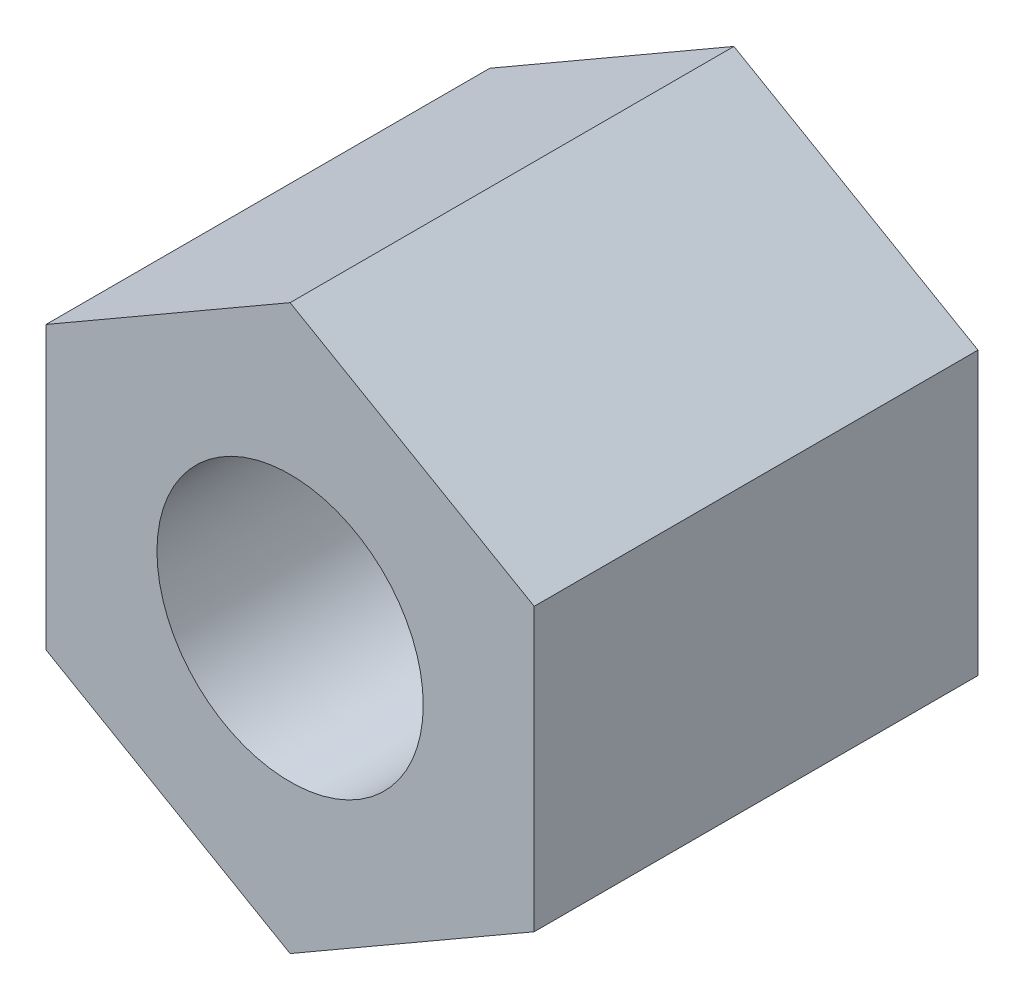
ISO-10303-21;
HEADER;
FILE_DESCRIPTION(('STEP AP214'),'2;1');
FILE_NAME('part.step','',(''),(''),'','','');
FILE_SCHEMA(('AUTOMOTIVE_DESIGN { 1 0 10303 214 1 1 1 1 }'));
ENDSEC;
DATA;
#1=APPLICATION_CONTEXT('core data for automotive mechanical design processes');
#2=APPLICATION_PROTOCOL_DEFINITION('international standard','automotive_design',2000,#1);
#3=PRODUCT_CONTEXT('',#1,'mechanical');
#4=PRODUCT('Part','Part','',(#3));
#5=PRODUCT_RELATED_PRODUCT_CATEGORY('part','',(#4));
#6=PRODUCT_DEFINITION_FORMATION('','',#4);
#7=PRODUCT_DEFINITION_CONTEXT('part definition',#1,'design');
#8=PRODUCT_DEFINITION('design','',#6,#7);
#9=PRODUCT_DEFINITION_SHAPE('','',#8);
#10=(LENGTH_UNIT() NAMED_UNIT(*) SI_UNIT(.MILLI.,.METRE.));
#11=(NAMED_UNIT(*) PLANE_ANGLE_UNIT() SI_UNIT($,.RADIAN.));
#12=(NAMED_UNIT(*) SI_UNIT($,.STERADIAN.) SOLID_ANGLE_UNIT());
#13=UNCERTAINTY_MEASURE_WITH_UNIT(LENGTH_MEASURE(1.E-05),#10,'distance_accuracy_value','');
#14=(GEOMETRIC_REPRESENTATION_CONTEXT(3) GLOBAL_UNCERTAINTY_ASSIGNED_CONTEXT((#13)) GLOBAL_UNIT_ASSIGNED_CONTEXT((#10,
#11,#12)) REPRESENTATION_CONTEXT('',''));
#15=CARTESIAN_POINT('',(0.,0.,0.));
#16=DIRECTION('',(0.,0.,1.));
#17=DIRECTION('',(1.,0.,0.));
#18=AXIS2_PLACEMENT_3D('',#15,#16,#17);
#19=CARTESIAN_POINT('',(2.75,1.58771324027147,5.));
#20=DIRECTION('',(-0.5,-0.866025403784439,0.));
#21=DIRECTION('',(0.866025403784439,-0.5,0.));
#22=AXIS2_PLACEMENT_3D('',#19,#20,#21);
#23=PLANE('',#22);
#24=DIRECTION('',(-0.866025403784439,0.5,0.));
#25=VECTOR('',#24,1.);
#26=CARTESIAN_POINT('',(2.75,1.58771324027147,0.));
#27=LINE('',#26,#25);
#28=CARTESIAN_POINT('',(2.75,1.58771324027147,0.));
#29=VERTEX_POINT('',#28);
#30=CARTESIAN_POINT('',(0.,3.17542648054294,0.));
#31=VERTEX_POINT('',#30);
#32=EDGE_CURVE('E123',#29,#31,#27,.T.);
#33=ORIENTED_EDGE('',*,*,#32,.T.);
#34=DIRECTION('',(0.,0.,-1.));
#35=VECTOR('',#34,1.);
#36=CARTESIAN_POINT('',(0.,3.17542648054294,5.));
#37=LINE('',#36,#35);
#38=CARTESIAN_POINT('',(0.,3.17542648054294,5.));
#39=VERTEX_POINT('',#38);
#40=EDGE_CURVE('E11',#39,#31,#37,.T.);
#41=ORIENTED_EDGE('',*,*,#40,.F.);
#42=DIRECTION('',(-0.866025403784439,0.5,0.));
#43=VECTOR('',#42,1.);
#44=CARTESIAN_POINT('',(2.75,1.58771324027147,5.));
#45=LINE('',#44,#43);
#46=CARTESIAN_POINT('',(2.75,1.58771324027147,5.));
#47=VERTEX_POINT('',#46);
#48=EDGE_CURVE('E137',#47,#39,#45,.T.);
#49=ORIENTED_EDGE('',*,*,#48,.F.);
#50=DIRECTION('',(0.,0.,-1.));
#51=VECTOR('',#50,1.);
#52=CARTESIAN_POINT('',(2.75,1.58771324027147,5.));
#53=LINE('',#52,#51);
#54=EDGE_CURVE('E122',#47,#29,#53,.T.);
#55=ORIENTED_EDGE('',*,*,#54,.T.);
#56=EDGE_LOOP('',(#33,#41,#49,#55));
#57=FACE_BOUND('',#56,.T.);
#58=ADVANCED_FACE('F41',(#57),#23,.F.);
#59=CARTESIAN_POINT('',(0.,3.17542648054294,5.));
#60=DIRECTION('',(0.5,-0.866025403784439,0.));
#61=DIRECTION('',(0.866025403784439,0.5,0.));
#62=AXIS2_PLACEMENT_3D('',#59,#60,#61);
#63=PLANE('',#62);
#64=DIRECTION('',(-0.866025403784439,-0.5,0.));
#65=VECTOR('',#64,1.);
#66=CARTESIAN_POINT('',(0.,3.17542648054294,0.));
#67=LINE('',#66,#65);
#68=CARTESIAN_POINT('',(-2.75,1.58771324027147,0.));
#69=VERTEX_POINT('',#68);
#70=EDGE_CURVE('E126',#31,#69,#67,.T.);
#71=ORIENTED_EDGE('',*,*,#70,.T.);
#72=DIRECTION('',(0.,0.,-1.));
#73=VECTOR('',#72,1.);
#74=CARTESIAN_POINT('',(-2.75,1.58771324027147,5.));
#75=LINE('',#74,#73);
#76=CARTESIAN_POINT('',(-2.75,1.58771324027147,5.));
#77=VERTEX_POINT('',#76);
#78=EDGE_CURVE('E47',#77,#69,#75,.T.);
#79=ORIENTED_EDGE('',*,*,#78,.F.);
#80=DIRECTION('',(-0.866025403784439,-0.5,0.));
#81=VECTOR('',#80,1.);
#82=CARTESIAN_POINT('',(0.,3.17542648054294,5.));
#83=LINE('',#82,#81);
#84=EDGE_CURVE('E94',#39,#77,#83,.T.);
#85=ORIENTED_EDGE('',*,*,#84,.F.);
#86=ORIENTED_EDGE('',*,*,#40,.T.);
#87=EDGE_LOOP('',(#71,#79,#85,#86));
#88=FACE_BOUND('',#87,.T.);
#89=ADVANCED_FACE('F161',(#88),#63,.F.);
#90=CARTESIAN_POINT('',(-2.75,1.58771324027147,5.));
#91=DIRECTION('',(1.,0.,0.));
#92=DIRECTION('',(0.,1.,0.));
#93=AXIS2_PLACEMENT_3D('',#90,#91,#92);
#94=PLANE('',#93);
#95=DIRECTION('',(0.,-1.,0.));
#96=VECTOR('',#95,1.);
#97=CARTESIAN_POINT('',(-2.75,1.58771324027147,0.));
#98=LINE('',#97,#96);
#99=CARTESIAN_POINT('',(-2.75,-1.58771324027147,0.));
#100=VERTEX_POINT('',#99);
#101=EDGE_CURVE('E132',#69,#100,#98,.T.);
#102=ORIENTED_EDGE('',*,*,#101,.T.);
#103=DIRECTION('',(0.,0.,-1.));
#104=VECTOR('',#103,1.);
#105=CARTESIAN_POINT('',(-2.75,-1.58771324027147,5.));
#106=LINE('',#105,#104);
#107=CARTESIAN_POINT('',(-2.75,-1.58771324027147,5.));
#108=VERTEX_POINT('',#107);
#109=EDGE_CURVE('E117',#108,#100,#106,.T.);
#110=ORIENTED_EDGE('',*,*,#109,.F.);
#111=DIRECTION('',(0.,-1.,0.));
#112=VECTOR('',#111,1.);
#113=CARTESIAN_POINT('',(-2.75,1.58771324027147,5.));
#114=LINE('',#113,#112);
#115=EDGE_CURVE('E110',#77,#108,#114,.T.);
#116=ORIENTED_EDGE('',*,*,#115,.F.);
#117=ORIENTED_EDGE('',*,*,#78,.T.);
#118=EDGE_LOOP('',(#102,#110,#116,#117));
#119=FACE_BOUND('',#118,.T.);
#120=ADVANCED_FACE('F142',(#119),#94,.F.);
#121=CARTESIAN_POINT('',(-2.75,-1.58771324027147,5.));
#122=DIRECTION('',(0.5,0.866025403784439,0.));
#123=DIRECTION('',(-0.866025403784439,0.5,0.));
#124=AXIS2_PLACEMENT_3D('',#121,#122,#123);
#125=PLANE('',#124);
#126=DIRECTION('',(0.866025403784439,-0.5,0.));
#127=VECTOR('',#126,1.);
#128=CARTESIAN_POINT('',(-2.75,-1.58771324027147,0.));
#129=LINE('',#128,#127);
#130=CARTESIAN_POINT('',(0.,-3.17542648054294,0.));
#131=VERTEX_POINT('',#130);
#132=EDGE_CURVE('E113',#100,#131,#129,.T.);
#133=ORIENTED_EDGE('',*,*,#132,.T.);
#134=DIRECTION('',(0.,0.,-1.));
#135=VECTOR('',#134,1.);
#136=CARTESIAN_POINT('',(0.,-3.17542648054294,5.));
#137=LINE('',#136,#135);
#138=CARTESIAN_POINT('',(0.,-3.17542648054294,5.));
#139=VERTEX_POINT('',#138);
#140=EDGE_CURVE('E115',#139,#131,#137,.T.);
#141=ORIENTED_EDGE('',*,*,#140,.F.);
#142=DIRECTION('',(0.866025403784439,-0.5,0.));
#143=VECTOR('',#142,1.);
#144=CARTESIAN_POINT('',(-2.75,-1.58771324027147,5.));
#145=LINE('',#144,#143);
#146=EDGE_CURVE('E101',#108,#139,#145,.T.);
#147=ORIENTED_EDGE('',*,*,#146,.F.);
#148=ORIENTED_EDGE('',*,*,#109,.T.);
#149=EDGE_LOOP('',(#133,#141,#147,#148));
#150=FACE_BOUND('',#149,.T.);
#151=ADVANCED_FACE('F114',(#150),#125,.F.);
#152=CARTESIAN_POINT('',(0.,-3.17542648054294,5.));
#153=DIRECTION('',(-0.5,0.866025403784439,0.));
#154=DIRECTION('',(-0.866025403784439,-0.5,0.));
#155=AXIS2_PLACEMENT_3D('',#152,#153,#154);
#156=PLANE('',#155);
#157=DIRECTION('',(0.866025403784439,0.5,0.));
#158=VECTOR('',#157,1.);
#159=CARTESIAN_POINT('',(0.,-3.17542648054294,0.));
#160=LINE('',#159,#158);
#161=CARTESIAN_POINT('',(2.75,-1.58771324027147,0.));
#162=VERTEX_POINT('',#161);
#163=EDGE_CURVE('E78',#131,#162,#160,.T.);
#164=ORIENTED_EDGE('',*,*,#163,.T.);
#165=DIRECTION('',(0.,0.,-1.));
#166=VECTOR('',#165,1.);
#167=CARTESIAN_POINT('',(2.75,-1.58771324027147,5.));
#168=LINE('',#167,#166);
#169=CARTESIAN_POINT('',(2.75,-1.58771324027147,5.));
#170=VERTEX_POINT('',#169);
#171=EDGE_CURVE('E120',#170,#162,#168,.T.);
#172=ORIENTED_EDGE('',*,*,#171,.F.);
#173=DIRECTION('',(0.866025403784439,0.5,0.));
#174=VECTOR('',#173,1.);
#175=CARTESIAN_POINT('',(0.,-3.17542648054294,5.));
#176=LINE('',#175,#174);
#177=EDGE_CURVE('E104',#139,#170,#176,.T.);
#178=ORIENTED_EDGE('',*,*,#177,.F.);
#179=ORIENTED_EDGE('',*,*,#140,.T.);
#180=EDGE_LOOP('',(#164,#172,#178,#179));
#181=FACE_BOUND('',#180,.T.);
#182=ADVANCED_FACE('F116',(#181),#156,.F.);
#183=CARTESIAN_POINT('',(2.75,-1.58771324027147,5.));
#184=DIRECTION('',(-1.,0.,0.));
#185=DIRECTION('',(0.,0.,1.));
#186=AXIS2_PLACEMENT_3D('',#183,#184,#185);
#187=PLANE('',#186);
#188=DIRECTION('',(0.,1.,0.));
#189=VECTOR('',#188,1.);
#190=CARTESIAN_POINT('',(2.75,-1.58771324027147,0.));
#191=LINE('',#190,#189);
#192=EDGE_CURVE('E88',#162,#29,#191,.T.);
#193=ORIENTED_EDGE('',*,*,#192,.T.);
#194=ORIENTED_EDGE('',*,*,#54,.F.);
#195=DIRECTION('',(0.,1.,0.));
#196=VECTOR('',#195,1.);
#197=CARTESIAN_POINT('',(2.75,-1.58771324027147,5.));
#198=LINE('',#197,#196);
#199=EDGE_CURVE('E60',#170,#47,#198,.T.);
#200=ORIENTED_EDGE('',*,*,#199,.F.);
#201=ORIENTED_EDGE('',*,*,#171,.T.);
#202=EDGE_LOOP('',(#193,#194,#200,#201));
#203=FACE_BOUND('',#202,.T.);
#204=ADVANCED_FACE('F149',(#203),#187,.F.);
#205=CARTESIAN_POINT('',(0.,0.,5.));
#206=DIRECTION('',(0.,0.,1.));
#207=DIRECTION('',(1.,0.,0.));
#208=AXIS2_PLACEMENT_3D('',#205,#206,#207);
#209=PLANE('',#208);
#210=CARTESIAN_POINT('',(0.,0.,5.));
#211=DIRECTION('',(0.,0.,1.));
#212=DIRECTION('',(1.,0.,0.));
#213=AXIS2_PLACEMENT_3D('',#210,#211,#212);
#214=CIRCLE('',#213,1.5);
#215=CARTESIAN_POINT('',(1.5,0.,5.));
#216=VERTEX_POINT('',#215);
#217=EDGE_CURVE('E220',#216,#216,#214,.T.);
#218=ORIENTED_EDGE('',*,*,#217,.F.);
#219=EDGE_LOOP('',(#218));
#220=FACE_BOUND('',#219,.T.);
#221=ORIENTED_EDGE('',*,*,#48,.T.);
#222=ORIENTED_EDGE('',*,*,#84,.T.);
#223=ORIENTED_EDGE('',*,*,#115,.T.);
#224=ORIENTED_EDGE('',*,*,#146,.T.);
#225=ORIENTED_EDGE('',*,*,#177,.T.);
#226=ORIENTED_EDGE('',*,*,#199,.T.);
#227=EDGE_LOOP('',(#221,#222,#223,#224,#225,#226));
#228=FACE_BOUND('',#227,.T.);
#229=ADVANCED_FACE('F103',(#220,#228),#209,.T.);
#230=CARTESIAN_POINT('',(0.,0.,0.));
#231=DIRECTION('',(0.,0.,1.));
#232=DIRECTION('',(1.,0.,0.));
#233=AXIS2_PLACEMENT_3D('',#230,#231,#232);
#234=PLANE('',#233);
#235=CARTESIAN_POINT('',(0.,0.,0.));
#236=DIRECTION('',(0.,0.,1.));
#237=DIRECTION('',(1.,0.,0.));
#238=AXIS2_PLACEMENT_3D('',#235,#236,#237);
#239=CIRCLE('',#238,1.5);
#240=CARTESIAN_POINT('',(1.5,0.,0.));
#241=VERTEX_POINT('',#240);
#242=EDGE_CURVE('E129',#241,#241,#239,.T.);
#243=ORIENTED_EDGE('',*,*,#242,.T.);
#244=EDGE_LOOP('',(#243));
#245=FACE_BOUND('',#244,.T.);
#246=ORIENTED_EDGE('',*,*,#32,.F.);
#247=ORIENTED_EDGE('',*,*,#192,.F.);
#248=ORIENTED_EDGE('',*,*,#163,.F.);
#249=ORIENTED_EDGE('',*,*,#132,.F.);
#250=ORIENTED_EDGE('',*,*,#101,.F.);
#251=ORIENTED_EDGE('',*,*,#70,.F.);
#252=EDGE_LOOP('',(#246,#247,#248,#249,#250,#251));
#253=FACE_BOUND('',#252,.T.);
#254=ADVANCED_FACE('F144',(#245,#253),#234,.F.);
#255=CARTESIAN_POINT('',(0.,0.,0.));
#256=DIRECTION('',(0.,0.,1.));
#257=DIRECTION('',(1.,0.,0.));
#258=AXIS2_PLACEMENT_3D('',#255,#256,#257);
#259=CYLINDRICAL_SURFACE('',#258,1.5);
#260=ORIENTED_EDGE('',*,*,#242,.F.);
#261=EDGE_LOOP('',(#260));
#262=FACE_BOUND('',#261,.T.);
#263=ORIENTED_EDGE('',*,*,#217,.T.);
#264=EDGE_LOOP('',(#263));
#265=FACE_BOUND('',#264,.T.);
#266=ADVANCED_FACE('F199',(#262,#265),#259,.F.);
#267=CLOSED_SHELL('',(#58,#89,#120,#151,#182,#204,#229,#254,#266));
#268=MANIFOLD_SOLID_BREP('B2',#267);
#269=ADVANCED_BREP_SHAPE_REPRESENTATION('',(#18,#268),#14);
#270=SHAPE_DEFINITION_REPRESENTATION(#9,#269);
ENDSEC;
END-ISO-10303-21;
